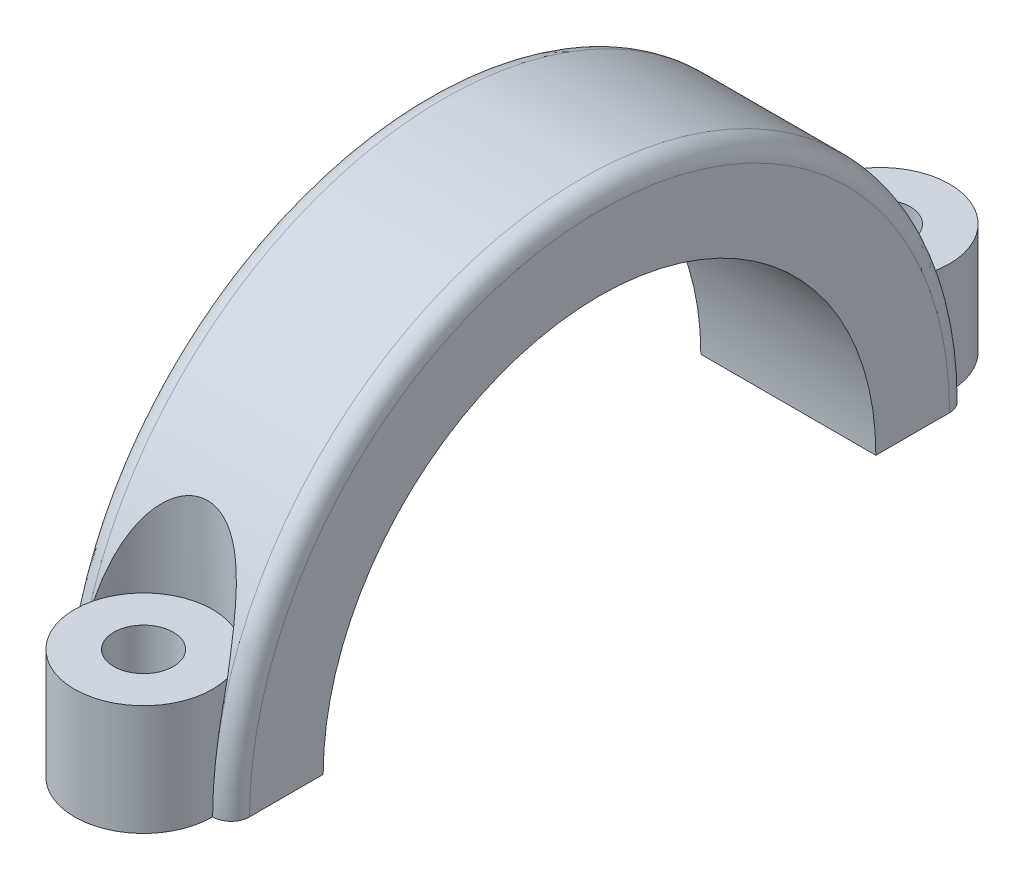
ISO-10303-21;
HEADER;
FILE_DESCRIPTION(('STEP AP214'),'2;1');
FILE_NAME('part.step','',(''),(''),'','','');
FILE_SCHEMA(('AUTOMOTIVE_DESIGN { 1 0 10303 214 1 1 1 1 }'));
ENDSEC;
DATA;
#1=APPLICATION_CONTEXT('core data for automotive mechanical design processes');
#2=APPLICATION_PROTOCOL_DEFINITION('international standard','automotive_design',2000,#1);
#3=PRODUCT_CONTEXT('',#1,'mechanical');
#4=PRODUCT('Part','Part','',(#3));
#5=PRODUCT_RELATED_PRODUCT_CATEGORY('part','',(#4));
#6=PRODUCT_DEFINITION_FORMATION('','',#4);
#7=PRODUCT_DEFINITION_CONTEXT('part definition',#1,'design');
#8=PRODUCT_DEFINITION('design','',#6,#7);
#9=PRODUCT_DEFINITION_SHAPE('','',#8);
#10=(LENGTH_UNIT() NAMED_UNIT(*) SI_UNIT(.MILLI.,.METRE.));
#11=(NAMED_UNIT(*) PLANE_ANGLE_UNIT() SI_UNIT($,.RADIAN.));
#12=(NAMED_UNIT(*) SI_UNIT($,.STERADIAN.) SOLID_ANGLE_UNIT());
#13=UNCERTAINTY_MEASURE_WITH_UNIT(LENGTH_MEASURE(1.E-05),#10,'distance_accuracy_value','');
#14=(GEOMETRIC_REPRESENTATION_CONTEXT(3) GLOBAL_UNCERTAINTY_ASSIGNED_CONTEXT((#13)) GLOBAL_UNIT_ASSIGNED_CONTEXT((#10,
#11,#12)) REPRESENTATION_CONTEXT('',''));
#15=CARTESIAN_POINT('',(0.,0.,0.));
#16=DIRECTION('',(0.,0.,1.));
#17=DIRECTION('',(1.,0.,0.));
#18=AXIS2_PLACEMENT_3D('',#15,#16,#17);
#19=CARTESIAN_POINT('',(12.065,0.,0.));
#20=DIRECTION('',(-1.,0.,0.));
#21=DIRECTION('',(0.,0.,1.));
#22=AXIS2_PLACEMENT_3D('',#19,#20,#21);
#23=CYLINDRICAL_SURFACE('',#22,50.8);
#24=CARTESIAN_POINT('',(9.525,0.,50.8));
#25=CARTESIAN_POINT('',(9.52499524301062,0.323784108117697,50.7999999648618));
#26=CARTESIAN_POINT('',(9.52500063813278,0.647560039520193,50.796904342456));
#27=CARTESIAN_POINT('',(9.52499030872866,1.29499363071079,50.7845235134187));
#28=CARTESIAN_POINT('',(9.52497458419629,1.61865129046479,50.7752383050037));
#29=CARTESIAN_POINT('',(9.524833601113,2.58925335265447,50.7381022328008));
#30=CARTESIAN_POINT('',(9.52461454281479,3.23586724527518,50.7009709216056));
#31=CARTESIAN_POINT('',(9.5230745866246,4.52327113701146,50.6023152371274));
#32=CARTESIAN_POINT('',(9.52176037301303,5.16407268459376,50.5409400288795));
#33=CARTESIAN_POINT('',(9.51662292577861,6.44289275223287,50.3938822741669));
#34=CARTESIAN_POINT('',(9.51279963935347,7.08091121343648,50.3081992161763));
#35=CARTESIAN_POINT('',(9.50067192560663,8.35324744973299,50.1126489497664));
#36=CARTESIAN_POINT('',(9.49236707769667,8.98756487183997,50.0027794720586));
#37=CARTESIAN_POINT('',(9.46874042044187,10.2514343945848,49.7590414176743));
#38=CARTESIAN_POINT('',(9.45341903193227,10.8809867787166,49.6251742806127));
#39=CARTESIAN_POINT('',(9.42274930643626,11.8228096901995,49.4061326748447));
#40=CARTESIAN_POINT('',(9.41119763481739,12.1372894464317,49.3298174313759));
#41=CARTESIAN_POINT('',(9.38505074642432,12.7646164837407,49.1712235836565));
#42=CARTESIAN_POINT('',(9.37045556794109,13.0774637853049,49.0889450544398));
#43=CARTESIAN_POINT('',(9.33771765798532,13.7014270502219,48.9184577558878));
#44=CARTESIAN_POINT('',(9.31957415274906,14.0125426206999,48.8302476958547));
#45=CARTESIAN_POINT('',(9.27917493970685,14.6328012028205,48.6479769352717));
#46=CARTESIAN_POINT('',(9.25691903983042,14.9419441216318,48.5539159615895));
#47=CARTESIAN_POINT('',(9.23232441302877,15.25,48.4569654435768));
#48=B_SPLINE_CURVE_WITH_KNOTS('',3,(#24,#25,#26,#27,#28,#29,#30,#31,#32,#33,#34,#35,#36,#37,#38,
#39,#40,#41,#42,#43,#44,#45,#46,#47),.UNSPECIFIED.,.F.,.F.,(4,2,2,2,2,2,2,2,2,2,2,4),(0.,
0.971321178069315,1.94264263603894,3.88516441042187,5.81591610707106,7.74670843679406,
9.67768200018313,11.6085397635848,12.5799192903469,13.5512865967242,14.5228659603849,
15.4944907133944),.UNSPECIFIED.);
#49=CARTESIAN_POINT('',(9.525,0.,50.8));
#50=VERTEX_POINT('',#49);
#51=CARTESIAN_POINT('',(9.23232441302877,15.25,48.4569654435768));
#52=VERTEX_POINT('',#51);
#53=EDGE_CURVE('E112',#50,#52,#48,.T.);
#54=ORIENTED_EDGE('',*,*,#53,.F.);
#55=CARTESIAN_POINT('',(9.525,0.,0.));
#56=DIRECTION('',(1.,0.,0.));
#57=DIRECTION('',(0.,0.,-1.));
#58=AXIS2_PLACEMENT_3D('',#55,#56,#57);
#59=CIRCLE('',#58,50.8);
#60=CARTESIAN_POINT('',(9.525,0.,-50.8));
#61=VERTEX_POINT('',#60);
#62=EDGE_CURVE('E264',#50,#61,#59,.F.);
#63=ORIENTED_EDGE('',*,*,#62,.T.);
#64=CARTESIAN_POINT('',(9.525,0.,-50.8));
#65=CARTESIAN_POINT('',(9.52499524301062,0.323784108117703,-50.7999999648618));
#66=CARTESIAN_POINT('',(9.52500063813278,0.647560039520198,-50.796904342456));
#67=CARTESIAN_POINT('',(9.52499030872866,1.2949936307108,-50.7845235134187));
#68=CARTESIAN_POINT('',(9.52497458419629,1.61865129046479,-50.7752383050037));
#69=CARTESIAN_POINT('',(9.524833601113,2.58925335265447,-50.7381022328008));
#70=CARTESIAN_POINT('',(9.52461454281479,3.23586724527518,-50.7009709216056));
#71=CARTESIAN_POINT('',(9.5230745866246,4.52327113701146,-50.6023152371274));
#72=CARTESIAN_POINT('',(9.52176037301303,5.16407268459376,-50.5409400288795));
#73=CARTESIAN_POINT('',(9.51662292577861,6.44289275223287,-50.3938822741669));
#74=CARTESIAN_POINT('',(9.51279963935347,7.08091121343648,-50.3081992161763));
#75=CARTESIAN_POINT('',(9.50067192560663,8.353247449733,-50.1126489497664));
#76=CARTESIAN_POINT('',(9.49236707769667,8.98756487183997,-50.0027794720586));
#77=CARTESIAN_POINT('',(9.46874042044187,10.2514343945848,-49.7590414176743));
#78=CARTESIAN_POINT('',(9.45341903193227,10.8809867787166,-49.6251742806127));
#79=CARTESIAN_POINT('',(9.42274930643626,11.8228096901995,-49.4061326748447));
#80=CARTESIAN_POINT('',(9.41119763481739,12.1372894464317,-49.3298174313759));
#81=CARTESIAN_POINT('',(9.38505074642432,12.7646164837407,-49.1712235836565));
#82=CARTESIAN_POINT('',(9.37045556794109,13.0774637853049,-49.0889450544398));
#83=CARTESIAN_POINT('',(9.33771765798532,13.7014270502219,-48.9184577558878));
#84=CARTESIAN_POINT('',(9.31957415274906,14.0125426206999,-48.8302476958547));
#85=CARTESIAN_POINT('',(9.27917493970685,14.6328012028205,-48.6479769352717));
#86=CARTESIAN_POINT('',(9.25691903983042,14.9419441216318,-48.5539159615895));
#87=CARTESIAN_POINT('',(9.23232441302877,15.25,-48.4569654435768));
#88=B_SPLINE_CURVE_WITH_KNOTS('',3,(#64,#65,#66,#67,#68,#69,#70,#71,#72,#73,#74,#75,#76,#77,#78,
#79,#80,#81,#82,#83,#84,#85,#86,#87),.UNSPECIFIED.,.F.,.F.,(4,2,2,2,2,2,2,2,2,2,2,4),(0.,
0.971321178069314,1.94264263603894,3.88516441042187,5.81591610707106,7.74670843679406,
9.67768200018313,11.6085397635848,12.5799192903469,13.5512865967242,14.5228659603849,
15.4944907133944),.UNSPECIFIED.);
#89=CARTESIAN_POINT('',(9.23232441302876,15.25,-48.4569654435768));
#90=VERTEX_POINT('',#89);
#91=EDGE_CURVE('E197',#61,#90,#88,.T.);
#92=ORIENTED_EDGE('',*,*,#91,.T.);
#93=CARTESIAN_POINT('',(9.23235120041083,15.2498,-48.4570283855707));
#94=CARTESIAN_POINT('',(9.18522638881166,15.6014587117969,-48.3463648711403));
#95=CARTESIAN_POINT('',(9.13499708919057,15.9515543219446,-48.2319739135129));
#96=CARTESIAN_POINT('',(9.02712526691807,16.6482379153794,-47.9959510668053));
#97=CARTESIAN_POINT('',(8.96948092552475,16.9948250155358,-47.8743174051981));
#98=CARTESIAN_POINT('',(8.84523887031784,17.6859276632865,-47.6233548096596));
#99=CARTESIAN_POINT('',(8.77859134956846,18.0304196714046,-47.4939854741127));
#100=CARTESIAN_POINT('',(8.63520341218567,18.7146742009327,-47.2285465671966));
#101=CARTESIAN_POINT('',(8.55846368404115,19.0544370432189,-47.092477453281));
#102=CARTESIAN_POINT('',(8.38909125786658,19.7457911737451,-46.806950853338));
#103=CARTESIAN_POINT('',(8.29584622541745,20.097098030416,-46.6571645650545));
#104=CARTESIAN_POINT('',(8.09438235177649,20.7927150766348,-46.3513467877677));
#105=CARTESIAN_POINT('',(7.98616176120967,21.1370244433717,-46.1953145706598));
#106=CARTESIAN_POINT('',(7.75267703115174,21.8164477216625,-45.8783474067616));
#107=CARTESIAN_POINT('',(7.62745480363361,22.1515818838614,-45.7174252489292));
#108=CARTESIAN_POINT('',(7.35714399629145,22.8116956161342,-45.3916504598138));
#109=CARTESIAN_POINT('',(7.21206184194566,23.1366784289761,-45.2267991139692));
#110=CARTESIAN_POINT('',(6.89843297122948,23.7754753467328,-44.8942851527211));
#111=CARTESIAN_POINT('',(6.72980482592874,24.089245732286,-44.7266146379124));
#112=CARTESIAN_POINT('',(6.36599404330493,24.7015019424877,-44.3914135119351));
#113=CARTESIAN_POINT('',(6.17079830709309,24.9999801269186,-44.2238830110528));
#114=CARTESIAN_POINT('',(5.75304583197571,25.5735508034141,-43.8946620827848));
#115=CARTESIAN_POINT('',(5.53088131108733,25.8488985658181,-43.7329238873445));
#116=CARTESIAN_POINT('',(5.05402709623586,26.3747863482101,-43.4177888719495));
#117=CARTESIAN_POINT('',(4.79938020992967,26.6253582617021,-43.2643814457825));
#118=CARTESIAN_POINT('',(4.26966362029435,27.0819091273838,-42.9799786753793));
#119=CARTESIAN_POINT('',(3.99648417914962,27.2895815506486,-42.848215102177));
#120=CARTESIAN_POINT('',(3.41715903115625,27.6690637105649,-42.6041535671033));
#121=CARTESIAN_POINT('',(3.11098051684749,27.840837248866,-42.4918752722128));
#122=CARTESIAN_POINT('',(2.62789069463921,28.0649695243252,-42.343897904961));
#123=CARTESIAN_POINT('',(2.4619220491559,28.1343763957633,-42.2977849305848));
#124=CARTESIAN_POINT('',(2.12320627790522,28.2603194515182,-42.2137425690608));
#125=CARTESIAN_POINT('',(1.95046282973072,28.316862508412,-42.1758088126811));
#126=CARTESIAN_POINT('',(1.59941491098995,28.415910107765,-42.1091394951715));
#127=CARTESIAN_POINT('',(1.42111528552077,28.4584265264412,-42.080396153247));
#128=CARTESIAN_POINT('',(1.06029072322424,28.5285209132247,-42.0329073220531));
#129=CARTESIAN_POINT('',(0.877766383009615,28.5561009773788,-42.0141604299687));
#130=CARTESIAN_POINT('',(0.529041646938692,28.5936298464793,-41.9886268707377));
#131=CARTESIAN_POINT('',(0.363077609540754,28.6050914830153,-41.980814363914));
#132=CARTESIAN_POINT('',(0.030582096196161,28.6151965274966,-41.973927253215));
#133=CARTESIAN_POINT('',(-0.135949338791823,28.6138408418763,-41.9748520314433));
#134=CARTESIAN_POINT('',(-0.468115301017656,28.5983407748568,-41.9854140153869));
#135=CARTESIAN_POINT('',(-0.633749917589236,28.5841976917204,-41.9950503366475));
#136=CARTESIAN_POINT('',(-0.962746838364978,28.5434188684291,-42.0227776891222));
#137=CARTESIAN_POINT('',(-1.1261091817242,28.5167833438152,-42.0408685744637));
#138=CARTESIAN_POINT('',(-1.43508262910439,28.454415610651,-42.0831024660083));
#139=CARTESIAN_POINT('',(-1.58099081563363,28.4196901113356,-42.1065728329459));
#140=CARTESIAN_POINT('',(-1.86909773715914,28.3408201089621,-42.1596984713993));
#141=CARTESIAN_POINT('',(-2.0112953126417,28.2966727003263,-42.1893556507732));
#142=CARTESIAN_POINT('',(-2.43127442428559,28.1509832546713,-42.2868276613504));
#143=CARTESIAN_POINT('',(-2.7026242402614,28.0361562499384,-42.3631688110983));
#144=CARTESIAN_POINT('',(-3.15231379739959,27.8124136494169,-42.5102609605935));
#145=CARTESIAN_POINT('',(-3.33570826545021,27.7105584618113,-42.5767745193356));
#146=CARTESIAN_POINT('',(-3.6911333543255,27.4930701519179,-42.7175358880945));
#147=CARTESIAN_POINT('',(-3.86315882949829,27.3774308563782,-42.7917871615828));
#148=CARTESIAN_POINT('',(-4.19590122823267,27.1340457390264,-42.9465293568611));
#149=CARTESIAN_POINT('',(-4.35659713210755,27.00627839536,-43.0270313229722));
#150=CARTESIAN_POINT('',(-4.66655422305021,26.7404753726302,-43.1927254581408));
#151=CARTESIAN_POINT('',(-4.81581732121104,26.602441417357,-43.2779168392121));
#152=CARTESIAN_POINT('',(-5.18204787147954,26.2395418368663,-43.4993440878932));
#153=CARTESIAN_POINT('',(-5.3914076481199,26.0084675986567,-43.6380195981482));
#154=CARTESIAN_POINT('',(-5.78608366158816,25.5292770508264,-43.9200804075425));
#155=CARTESIAN_POINT('',(-5.97138581659674,25.2811508888608,-44.0634684040955));
#156=CARTESIAN_POINT('',(-6.32051763537905,24.7707771948262,-44.3523927033534));
#157=CARTESIAN_POINT('',(-6.48431136993701,24.5085070409594,-44.4979321600195));
#158=CARTESIAN_POINT('',(-6.79246158100446,23.972647350455,-44.7888959218338));
#159=CARTESIAN_POINT('',(-6.93681056938826,23.69905350581,-44.9343201613025));
#160=CARTESIAN_POINT('',(-7.19842320572738,23.1626140327431,-45.21302931923));
#161=CARTESIAN_POINT('',(-7.31688854850832,22.9004121863888,-45.3464345913139));
#162=CARTESIAN_POINT('',(-7.5404936764931,22.3692630869549,-45.6107888747024));
#163=CARTESIAN_POINT('',(-7.64563552570952,22.1003168864305,-45.7417382637761));
#164=CARTESIAN_POINT('',(-7.84415840813845,21.5563669449214,-46.0005854318616));
#165=CARTESIAN_POINT('',(-7.93752861388656,21.2813578965645,-46.1284803149932));
#166=CARTESIAN_POINT('',(-8.11371325802051,20.7262970094558,-46.380529674833));
#167=CARTESIAN_POINT('',(-8.19652734060473,20.4462450010903,-46.5046840253563));
#168=CARTESIAN_POINT('',(-8.35283898417087,19.8815391640943,-46.7488940527323));
#169=CARTESIAN_POINT('',(-8.4263296918322,19.5968821217638,-46.8689466677051));
#170=CARTESIAN_POINT('',(-8.56498994027281,19.0236827574803,-47.1045175039349));
#171=CARTESIAN_POINT('',(-8.63015873904918,18.7351400916072,-47.2200353202224));
#172=CARTESIAN_POINT('',(-8.81458108402447,17.8646958204205,-47.5592266517257));
#173=CARTESIAN_POINT('',(-8.92285055450764,17.2776060252608,-47.7756991402217));
#174=CARTESIAN_POINT('',(-9.05864533925222,16.4472913363415,-48.0644376577784));
#175=CARTESIAN_POINT('',(-9.09571460708629,16.2085532499715,-48.1454725407958));
#176=CARTESIAN_POINT('',(-9.16645609725028,15.7300597993721,-48.3039183187987));
#177=CARTESIAN_POINT('',(-9.20013667736159,15.4903085373638,-48.3813378643115));
#178=CARTESIAN_POINT('',(-9.23235120041083,15.2498,-48.4570283855707));
#179=B_SPLINE_CURVE_WITH_KNOTS('',3,(#93,#94,#95,#96,#97,#98,#99,#100,#101,#102,#103,#104,#105,
#106,#107,#108,#109,#110,#111,#112,#113,#114,#115,#116,#117,#118,#119,#120,#121,#122,#123,#124,
#125,#126,#127,#128,#129,#130,#131,#132,#133,#134,#135,#136,#137,#138,#139,#140,#141,#142,#143,
#144,#145,#146,#147,#148,#149,#150,#151,#152,#153,#154,#155,#156,#157,#158,#159,#160,#161,#162,
#163,#164,#165,#166,#167,#168,#169,#170,#171,#172,#173,#174,#175,#176,#177,#178),.UNSPECIFIED.,
.F.,.F.,(4,2,2,2,2,2,2,2,2,2,2,2,2,2,2,2,2,2,2,2,2,2,2,2,2,2,2,2,2,2,2,2,2,2,2,2,2,2,2,2,2,2,4),
(0.,1.11498112347065,2.2302362499074,3.35193516202373,4.47355759166417,5.65257679892295,
6.83173385016446,8.00803513965995,9.18395674436279,10.364050676296,11.5447285639126,
12.7099289796496,13.8736093736072,14.9733666504816,16.0742275645706,16.6307420181423,
17.1869584483462,17.742702719643,18.298368982078,18.7972931092225,19.2961819529774,
19.7950201518596,20.2938497442522,20.7487846649762,21.2038600841664,22.1134540243881,
22.7728738273677,23.4325900708726,24.0934997171056,24.7542986443355,25.7764238545014,
26.7991446807126,27.8235527702976,28.8483542360575,29.7993934974996,30.7502852478573,
31.7020453371164,32.6538374976475,33.6063252862019,34.5588979418208,36.4627929258789,
37.2272435522731,37.9897599916397),.UNSPECIFIED.);
#180=CARTESIAN_POINT('',(-9.23232441302876,15.25,-48.4569654435768));
#181=VERTEX_POINT('',#180);
#182=EDGE_CURVE('E174',#90,#181,#179,.T.);
#183=ORIENTED_EDGE('',*,*,#182,.T.);
#184=CARTESIAN_POINT('',(-9.23232441302876,15.25,-48.4569654435768));
#185=CARTESIAN_POINT('',(-9.25691903983042,14.9419441216318,-48.5539159615895));
#186=CARTESIAN_POINT('',(-9.27917493970685,14.6328012028205,-48.6479769352717));
#187=CARTESIAN_POINT('',(-9.31957415274906,14.0125426206999,-48.8302476958547));
#188=CARTESIAN_POINT('',(-9.33771765798532,13.7014270502219,-48.9184577558878));
#189=CARTESIAN_POINT('',(-9.37045556794108,13.0774637853049,-49.0889450544398));
#190=CARTESIAN_POINT('',(-9.38505074642431,12.7646164837407,-49.1712235836565));
#191=CARTESIAN_POINT('',(-9.41119763481738,12.1372894464317,-49.3298174313758));
#192=CARTESIAN_POINT('',(-9.42274930643625,11.8228096901995,-49.4061326748446));
#193=CARTESIAN_POINT('',(-9.45341903193226,10.8809867787166,-49.6251742806127));
#194=CARTESIAN_POINT('',(-9.46874042044186,10.2514343945849,-49.7590414176743));
#195=CARTESIAN_POINT('',(-9.49236707769666,8.98756487183998,-50.0027794720585));
#196=CARTESIAN_POINT('',(-9.50067192560662,8.35324744973301,-50.1126489497664));
#197=CARTESIAN_POINT('',(-9.51279963935347,7.0809112134365,-50.3081992161763));
#198=CARTESIAN_POINT('',(-9.5166229257786,6.4428927522329,-50.3938822741669));
#199=CARTESIAN_POINT('',(-9.52176037301302,5.16407268459379,-50.5409400288795));
#200=CARTESIAN_POINT('',(-9.52307458662458,4.52327113701149,-50.6023152371274));
#201=CARTESIAN_POINT('',(-9.52461454281479,3.23586724527522,-50.7009709216056));
#202=CARTESIAN_POINT('',(-9.52483360111304,2.58925335265451,-50.7381022328008));
#203=CARTESIAN_POINT('',(-9.52497458419626,1.61865129046483,-50.7752383050037));
#204=CARTESIAN_POINT('',(-9.52499030872859,1.29499363071084,-50.7845235134187));
#205=CARTESIAN_POINT('',(-9.52500063813284,0.647560039520247,-50.796904342456));
#206=CARTESIAN_POINT('',(-9.52499524301084,0.323784108117753,-50.7999999648618));
#207=CARTESIAN_POINT('',(-9.5250000000006,0.,-50.8));
#208=B_SPLINE_CURVE_WITH_KNOTS('',3,(#184,#185,#186,#187,#188,#189,#190,#191,#192,#193,#194,
#195,#196,#197,#198,#199,#200,#201,#202,#203,#204,#205,#206,#207),.UNSPECIFIED.,.F.,.F.,(4,2,2,
2,2,2,2,2,2,2,2,4),(0.,0.971624753009543,1.94320411667025,2.9145714230475,3.88595094980956,
5.81680871321127,7.74778227660034,9.67857460632333,11.6093263029725,13.5518480773554,
14.5231695353251,15.4944907133944),.UNSPECIFIED.);
#209=CARTESIAN_POINT('',(-9.525,0.,-50.8));
#210=VERTEX_POINT('',#209);
#211=EDGE_CURVE('E188',#181,#210,#208,.T.);
#212=ORIENTED_EDGE('',*,*,#211,.T.);
#213=CARTESIAN_POINT('',(-9.525,0.,0.));
#214=DIRECTION('',(1.,0.,0.));
#215=DIRECTION('',(0.,0.,-1.));
#216=AXIS2_PLACEMENT_3D('',#213,#214,#215);
#217=CIRCLE('',#216,50.8);
#218=CARTESIAN_POINT('',(-9.52499999999999,0.,50.8));
#219=VERTEX_POINT('',#218);
#220=EDGE_CURVE('E262',#210,#219,#217,.T.);
#221=ORIENTED_EDGE('',*,*,#220,.T.);
#222=CARTESIAN_POINT('',(-9.23232441302876,15.25,48.4569654435768));
#223=CARTESIAN_POINT('',(-9.25691903983042,14.9419441216318,48.5539159615895));
#224=CARTESIAN_POINT('',(-9.27917493970685,14.6328012028205,48.6479769352717));
#225=CARTESIAN_POINT('',(-9.31957415274905,14.0125426206999,48.8302476958547));
#226=CARTESIAN_POINT('',(-9.33771765798531,13.7014270502219,48.9184577558878));
#227=CARTESIAN_POINT('',(-9.37045556794108,13.0774637853049,49.0889450544398));
#228=CARTESIAN_POINT('',(-9.38505074642431,12.7646164837407,49.1712235836565));
#229=CARTESIAN_POINT('',(-9.41119763481738,12.1372894464317,49.3298174313758));
#230=CARTESIAN_POINT('',(-9.42274930643625,11.8228096901995,49.4061326748447));
#231=CARTESIAN_POINT('',(-9.45341903193226,10.8809867787166,49.6251742806127));
#232=CARTESIAN_POINT('',(-9.46874042044186,10.2514343945849,49.7590414176743));
#233=CARTESIAN_POINT('',(-9.49236707769666,8.98756487183999,50.0027794720586));
#234=CARTESIAN_POINT('',(-9.50067192560662,8.35324744973301,50.1126489497664));
#235=CARTESIAN_POINT('',(-9.51279963935347,7.0809112134365,50.3081992161763));
#236=CARTESIAN_POINT('',(-9.5166229257786,6.4428927522329,50.3938822741669));
#237=CARTESIAN_POINT('',(-9.52176037301302,5.16407268459379,50.5409400288795));
#238=CARTESIAN_POINT('',(-9.52307458662458,4.52327113701149,50.6023152371274));
#239=CARTESIAN_POINT('',(-9.52461454281479,3.23586724527522,50.7009709216056));
#240=CARTESIAN_POINT('',(-9.52483360111304,2.58925335265451,50.7381022328008));
#241=CARTESIAN_POINT('',(-9.52497458419626,1.61865129046483,50.7752383050037));
#242=CARTESIAN_POINT('',(-9.52499030872859,1.29499363071084,50.7845235134187));
#243=CARTESIAN_POINT('',(-9.52500063813284,0.647560039520243,50.796904342456));
#244=CARTESIAN_POINT('',(-9.52499524301084,0.32378410811775,50.7999999648618));
#245=CARTESIAN_POINT('',(-9.5250000000006,0.,50.8));
#246=B_SPLINE_CURVE_WITH_KNOTS('',3,(#222,#223,#224,#225,#226,#227,#228,#229,#230,#231,#232,
#233,#234,#235,#236,#237,#238,#239,#240,#241,#242,#243,#244,#245),.UNSPECIFIED.,.F.,.F.,(4,2,2,
2,2,2,2,2,2,2,2,4),(0.,0.971624753009543,1.94320411667025,2.9145714230475,3.88595094980956,
5.81680871321127,7.74778227660034,9.67857460632333,11.6093263029725,13.5518480773554,
14.5231695353251,15.4944907133944),.UNSPECIFIED.);
#247=CARTESIAN_POINT('',(-9.23232441302876,15.25,48.4569654435768));
#248=VERTEX_POINT('',#247);
#249=EDGE_CURVE('E116',#248,#219,#246,.T.);
#250=ORIENTED_EDGE('',*,*,#249,.F.);
#251=CARTESIAN_POINT('',(9.23235120041083,15.2498,48.4570283855707));
#252=CARTESIAN_POINT('',(9.18522638881166,15.6014587117969,48.3463648711403));
#253=CARTESIAN_POINT('',(9.13499708919057,15.9515543219446,48.2319739135129));
#254=CARTESIAN_POINT('',(9.02712526691807,16.6482379153794,47.9959510668053));
#255=CARTESIAN_POINT('',(8.96948092552475,16.9948250155358,47.8743174051981));
#256=CARTESIAN_POINT('',(8.84523887031784,17.6859276632865,47.6233548096596));
#257=CARTESIAN_POINT('',(8.77859134956846,18.0304196714046,47.4939854741127));
#258=CARTESIAN_POINT('',(8.63520341218567,18.7146742009327,47.2285465671966));
#259=CARTESIAN_POINT('',(8.55846368404115,19.0544370432189,47.092477453281));
#260=CARTESIAN_POINT('',(8.38909125786658,19.7457911737451,46.806950853338));
#261=CARTESIAN_POINT('',(8.29584622541745,20.097098030416,46.6571645650545));
#262=CARTESIAN_POINT('',(8.09438235177649,20.7927150766348,46.3513467877677));
#263=CARTESIAN_POINT('',(7.98616176120967,21.1370244433717,46.1953145706598));
#264=CARTESIAN_POINT('',(7.75267703115174,21.8164477216625,45.8783474067616));
#265=CARTESIAN_POINT('',(7.62745480363361,22.1515818838614,45.7174252489292));
#266=CARTESIAN_POINT('',(7.35714399629145,22.8116956161342,45.3916504598138));
#267=CARTESIAN_POINT('',(7.21206184194566,23.1366784289761,45.2267991139692));
#268=CARTESIAN_POINT('',(6.89843297122948,23.7754753467328,44.8942851527211));
#269=CARTESIAN_POINT('',(6.72980482592874,24.089245732286,44.7266146379124));
#270=CARTESIAN_POINT('',(6.36599404330493,24.7015019424877,44.3914135119351));
#271=CARTESIAN_POINT('',(6.17079830709309,24.9999801269186,44.2238830110528));
#272=CARTESIAN_POINT('',(5.75304583197571,25.5735508034141,43.8946620827848));
#273=CARTESIAN_POINT('',(5.53088131108733,25.8488985658181,43.7329238873445));
#274=CARTESIAN_POINT('',(5.05402709623586,26.3747863482101,43.4177888719495));
#275=CARTESIAN_POINT('',(4.79938020992967,26.6253582617021,43.2643814457825));
#276=CARTESIAN_POINT('',(4.26966362029435,27.0819091273838,42.9799786753793));
#277=CARTESIAN_POINT('',(3.99648417914962,27.2895815506486,42.848215102177));
#278=CARTESIAN_POINT('',(3.41715903115625,27.6690637105649,42.6041535671033));
#279=CARTESIAN_POINT('',(3.11098051684749,27.840837248866,42.4918752722128));
#280=CARTESIAN_POINT('',(2.62789069463921,28.0649695243252,42.343897904961));
#281=CARTESIAN_POINT('',(2.4619220491559,28.1343763957633,42.2977849305848));
#282=CARTESIAN_POINT('',(2.12320627790522,28.2603194515182,42.2137425690608));
#283=CARTESIAN_POINT('',(1.95046282973072,28.316862508412,42.1758088126811));
#284=CARTESIAN_POINT('',(1.59941491098995,28.415910107765,42.1091394951715));
#285=CARTESIAN_POINT('',(1.42111528552077,28.4584265264412,42.080396153247));
#286=CARTESIAN_POINT('',(1.06029072322424,28.5285209132247,42.0329073220531));
#287=CARTESIAN_POINT('',(0.877766383009615,28.5561009773788,42.0141604299687));
#288=CARTESIAN_POINT('',(0.529041646938692,28.5936298464793,41.9886268707377));
#289=CARTESIAN_POINT('',(0.363077609540754,28.6050914830153,41.980814363914));
#290=CARTESIAN_POINT('',(0.030582096196161,28.6151965274966,41.973927253215));
#291=CARTESIAN_POINT('',(-0.135949338791823,28.6138408418763,41.9748520314433));
#292=CARTESIAN_POINT('',(-0.468115301017656,28.5983407748568,41.9854140153869));
#293=CARTESIAN_POINT('',(-0.633749917589236,28.5841976917204,41.9950503366475));
#294=CARTESIAN_POINT('',(-0.962746838364978,28.5434188684291,42.0227776891222));
#295=CARTESIAN_POINT('',(-1.1261091817242,28.5167833438152,42.0408685744637));
#296=CARTESIAN_POINT('',(-1.43508262910439,28.454415610651,42.0831024660083));
#297=CARTESIAN_POINT('',(-1.58099081563363,28.4196901113356,42.1065728329459));
#298=CARTESIAN_POINT('',(-1.86909773715914,28.3408201089621,42.1596984713993));
#299=CARTESIAN_POINT('',(-2.0112953126417,28.2966727003263,42.1893556507732));
#300=CARTESIAN_POINT('',(-2.43127442428559,28.1509832546713,42.2868276613504));
#301=CARTESIAN_POINT('',(-2.7026242402614,28.0361562499384,42.3631688110983));
#302=CARTESIAN_POINT('',(-3.15231379739959,27.8124136494169,42.5102609605935));
#303=CARTESIAN_POINT('',(-3.33570826545021,27.7105584618113,42.5767745193356));
#304=CARTESIAN_POINT('',(-3.6911333543255,27.4930701519179,42.7175358880945));
#305=CARTESIAN_POINT('',(-3.86315882949829,27.3774308563782,42.7917871615828));
#306=CARTESIAN_POINT('',(-4.19590122823267,27.1340457390264,42.9465293568611));
#307=CARTESIAN_POINT('',(-4.35659713210755,27.00627839536,43.0270313229722));
#308=CARTESIAN_POINT('',(-4.66655422305021,26.7404753726302,43.1927254581408));
#309=CARTESIAN_POINT('',(-4.81581732121104,26.602441417357,43.2779168392121));
#310=CARTESIAN_POINT('',(-5.18204787147954,26.2395418368663,43.4993440878932));
#311=CARTESIAN_POINT('',(-5.3914076481199,26.0084675986567,43.6380195981482));
#312=CARTESIAN_POINT('',(-5.78608366158816,25.5292770508264,43.9200804075425));
#313=CARTESIAN_POINT('',(-5.97138581659674,25.2811508888608,44.0634684040955));
#314=CARTESIAN_POINT('',(-6.32051763537905,24.7707771948262,44.3523927033534));
#315=CARTESIAN_POINT('',(-6.48431136993701,24.5085070409594,44.4979321600195));
#316=CARTESIAN_POINT('',(-6.79246158100446,23.972647350455,44.7888959218338));
#317=CARTESIAN_POINT('',(-6.93681056938826,23.69905350581,44.9343201613025));
#318=CARTESIAN_POINT('',(-7.19842320572738,23.1626140327431,45.21302931923));
#319=CARTESIAN_POINT('',(-7.31688854850832,22.9004121863888,45.3464345913139));
#320=CARTESIAN_POINT('',(-7.5404936764931,22.3692630869549,45.6107888747024));
#321=CARTESIAN_POINT('',(-7.64563552570952,22.1003168864305,45.7417382637761));
#322=CARTESIAN_POINT('',(-7.84415840813845,21.5563669449214,46.0005854318616));
#323=CARTESIAN_POINT('',(-7.93752861388656,21.2813578965645,46.1284803149932));
#324=CARTESIAN_POINT('',(-8.11371325802051,20.7262970094558,46.380529674833));
#325=CARTESIAN_POINT('',(-8.19652734060473,20.4462450010903,46.5046840253563));
#326=CARTESIAN_POINT('',(-8.35283898417087,19.8815391640943,46.7488940527323));
#327=CARTESIAN_POINT('',(-8.4263296918322,19.5968821217638,46.8689466677051));
#328=CARTESIAN_POINT('',(-8.56498994027281,19.0236827574803,47.1045175039349));
#329=CARTESIAN_POINT('',(-8.63015873904918,18.7351400916072,47.2200353202224));
#330=CARTESIAN_POINT('',(-8.81458108402447,17.8646958204205,47.5592266517257));
#331=CARTESIAN_POINT('',(-8.92285055450764,17.2776060252608,47.7756991402217));
#332=CARTESIAN_POINT('',(-9.05864533925222,16.4472913363415,48.0644376577784));
#333=CARTESIAN_POINT('',(-9.09571460708629,16.2085532499715,48.1454725407958));
#334=CARTESIAN_POINT('',(-9.16645609725028,15.7300597993721,48.3039183187987));
#335=CARTESIAN_POINT('',(-9.20013667736159,15.4903085373638,48.3813378643115));
#336=CARTESIAN_POINT('',(-9.23235120041083,15.2498,48.4570283855707));
#337=B_SPLINE_CURVE_WITH_KNOTS('',3,(#251,#252,#253,#254,#255,#256,#257,#258,#259,#260,#261,
#262,#263,#264,#265,#266,#267,#268,#269,#270,#271,#272,#273,#274,#275,#276,#277,#278,#279,#280,
#281,#282,#283,#284,#285,#286,#287,#288,#289,#290,#291,#292,#293,#294,#295,#296,#297,#298,#299,
#300,#301,#302,#303,#304,#305,#306,#307,#308,#309,#310,#311,#312,#313,#314,#315,#316,#317,#318,
#319,#320,#321,#322,#323,#324,#325,#326,#327,#328,#329,#330,#331,#332,#333,#334,#335,#336),
.UNSPECIFIED.,.F.,.F.,(4,2,2,2,2,2,2,2,2,2,2,2,2,2,2,2,2,2,2,2,2,2,2,2,2,2,2,2,2,2,2,2,2,2,2,2,
2,2,2,2,2,2,4),(0.,1.11498112347065,2.2302362499074,3.35193516202373,4.47355759166417,
5.65257679892295,6.83173385016446,8.00803513965995,9.18395674436279,10.364050676296,
11.5447285639126,12.7099289796496,13.8736093736072,14.9733666504816,16.0742275645706,
16.6307420181423,17.1869584483462,17.742702719643,18.298368982078,18.7972931092225,
19.2961819529774,19.7950201518596,20.2938497442522,20.7487846649762,21.2038600841664,
22.1134540243881,22.7728738273677,23.4325900708726,24.0934997171056,24.7542986443355,
25.7764238545014,26.7991446807126,27.8235527702976,28.8483542360575,29.7993934974996,
30.7502852478573,31.7020453371164,32.6538374976475,33.6063252862019,34.5588979418208,
36.4627929258789,37.2272435522731,37.9897599916397),.UNSPECIFIED.);
#338=EDGE_CURVE('E103',#52,#248,#337,.T.);
#339=ORIENTED_EDGE('',*,*,#338,.F.);
#340=EDGE_LOOP('',(#54,#63,#92,#183,#212,#221,#250,#339));
#341=FACE_BOUND('',#340,.T.);
#342=ADVANCED_FACE('F37',(#341),#23,.T.);
#343=CARTESIAN_POINT('',(12.065,0.,50.8));
#344=DIRECTION('',(0.,1.,0.));
#345=DIRECTION('',(0.,0.,1.));
#346=AXIS2_PLACEMENT_3D('',#343,#344,#345);
#347=PLANE('',#346);
#348=CARTESIAN_POINT('',(0.,0.,50.8));
#349=DIRECTION('',(0.,-1.,0.));
#350=DIRECTION('',(0.,0.,-1.));
#351=AXIS2_PLACEMENT_3D('',#348,#349,#350);
#352=CIRCLE('',#351,6.74751);
#353=CARTESIAN_POINT('',(0.,0.,44.05249));
#354=VERTEX_POINT('',#353);
#355=EDGE_CURVE('E117',#354,#354,#352,.T.);
#356=ORIENTED_EDGE('',*,*,#355,.F.);
#357=EDGE_LOOP('',(#356));
#358=FACE_BOUND('',#357,.T.);
#359=DIRECTION('',(0.,0.,-1.));
#360=VECTOR('',#359,1.);
#361=CARTESIAN_POINT('',(12.065,0.,50.8));
#362=LINE('',#361,#360);
#363=CARTESIAN_POINT('',(12.065,0.,48.26));
#364=VERTEX_POINT('',#363);
#365=CARTESIAN_POINT('',(12.065,0.,38.1));
#366=VERTEX_POINT('',#365);
#367=EDGE_CURVE('E232',#364,#366,#362,.T.);
#368=ORIENTED_EDGE('',*,*,#367,.F.);
#369=CARTESIAN_POINT('',(9.525,0.,48.26));
#370=DIRECTION('',(0.,1.,0.));
#371=DIRECTION('',(0.,0.,1.));
#372=AXIS2_PLACEMENT_3D('',#369,#370,#371);
#373=CIRCLE('',#372,2.54);
#374=EDGE_CURVE('E233',#364,#50,#373,.F.);
#375=ORIENTED_EDGE('',*,*,#374,.T.);
#376=CARTESIAN_POINT('',(0.,0.,50.8));
#377=DIRECTION('',(0.,1.,0.));
#378=DIRECTION('',(0.,0.,1.));
#379=AXIS2_PLACEMENT_3D('',#376,#377,#378);
#380=CIRCLE('',#379,9.525);
#381=EDGE_CURVE('E123',#219,#50,#380,.T.);
#382=ORIENTED_EDGE('',*,*,#381,.F.);
#383=CARTESIAN_POINT('',(-9.525,0.,48.26));
#384=DIRECTION('',(0.,1.,0.));
#385=DIRECTION('',(0.,0.,1.));
#386=AXIS2_PLACEMENT_3D('',#383,#384,#385);
#387=CIRCLE('',#386,2.54);
#388=CARTESIAN_POINT('',(-12.065,0.,48.26));
#389=VERTEX_POINT('',#388);
#390=EDGE_CURVE('E58',#219,#389,#387,.F.);
#391=ORIENTED_EDGE('',*,*,#390,.T.);
#392=DIRECTION('',(0.,0.,-1.));
#393=VECTOR('',#392,1.);
#394=CARTESIAN_POINT('',(-12.065,0.,50.8));
#395=LINE('',#394,#393);
#396=CARTESIAN_POINT('',(-12.065,0.,38.1));
#397=VERTEX_POINT('',#396);
#398=EDGE_CURVE('E248',#389,#397,#395,.T.);
#399=ORIENTED_EDGE('',*,*,#398,.T.);
#400=DIRECTION('',(-1.,0.,0.));
#401=VECTOR('',#400,1.);
#402=CARTESIAN_POINT('',(12.065,0.,38.1));
#403=LINE('',#402,#401);
#404=EDGE_CURVE('E235',#366,#397,#403,.T.);
#405=ORIENTED_EDGE('',*,*,#404,.F.);
#406=EDGE_LOOP('',(#368,#375,#382,#391,#399,#405));
#407=FACE_BOUND('',#406,.T.);
#408=ADVANCED_FACE('F221',(#358,#407),#347,.F.);
#409=CARTESIAN_POINT('',(12.065,0.,0.));
#410=DIRECTION('',(-1.,0.,0.));
#411=DIRECTION('',(0.,0.,1.));
#412=AXIS2_PLACEMENT_3D('',#409,#410,#411);
#413=CYLINDRICAL_SURFACE('',#412,38.1);
#414=CARTESIAN_POINT('',(-12.065,0.,0.));
#415=DIRECTION('',(-1.,0.,0.));
#416=DIRECTION('',(0.,0.,-1.));
#417=AXIS2_PLACEMENT_3D('',#414,#415,#416);
#418=CIRCLE('',#417,38.1);
#419=CARTESIAN_POINT('',(-12.065,0.,-38.1));
#420=VERTEX_POINT('',#419);
#421=EDGE_CURVE('E242',#397,#420,#418,.T.);
#422=ORIENTED_EDGE('',*,*,#421,.T.);
#423=DIRECTION('',(-1.,0.,0.));
#424=VECTOR('',#423,1.);
#425=CARTESIAN_POINT('',(12.065,0.,-38.1));
#426=LINE('',#425,#424);
#427=CARTESIAN_POINT('',(12.065,0.,-38.1));
#428=VERTEX_POINT('',#427);
#429=EDGE_CURVE('E247',#428,#420,#426,.T.);
#430=ORIENTED_EDGE('',*,*,#429,.F.);
#431=CARTESIAN_POINT('',(12.065,0.,0.));
#432=DIRECTION('',(-1.,0.,0.));
#433=DIRECTION('',(0.,0.,-1.));
#434=AXIS2_PLACEMENT_3D('',#431,#432,#433);
#435=CIRCLE('',#434,38.1);
#436=EDGE_CURVE('E238',#366,#428,#435,.T.);
#437=ORIENTED_EDGE('',*,*,#436,.F.);
#438=ORIENTED_EDGE('',*,*,#404,.T.);
#439=EDGE_LOOP('',(#422,#430,#437,#438));
#440=FACE_BOUND('',#439,.T.);
#441=ADVANCED_FACE('F218',(#440),#413,.F.);
#442=CARTESIAN_POINT('',(12.065,0.,-38.1));
#443=DIRECTION('',(0.,1.,0.));
#444=DIRECTION('',(0.,0.,1.));
#445=AXIS2_PLACEMENT_3D('',#442,#443,#444);
#446=PLANE('',#445);
#447=CARTESIAN_POINT('',(0.,0.,-50.8));
#448=DIRECTION('',(0.,-1.,0.));
#449=DIRECTION('',(0.,0.,-1.));
#450=AXIS2_PLACEMENT_3D('',#447,#448,#449);
#451=CIRCLE('',#450,6.74751);
#452=CARTESIAN_POINT('',(0.,0.,-57.54751));
#453=VERTEX_POINT('',#452);
#454=EDGE_CURVE('E124',#453,#453,#451,.T.);
#455=ORIENTED_EDGE('',*,*,#454,.F.);
#456=EDGE_LOOP('',(#455));
#457=FACE_BOUND('',#456,.T.);
#458=CARTESIAN_POINT('',(0.,0.,-50.8));
#459=DIRECTION('',(0.,-1.,0.));
#460=DIRECTION('',(0.,0.,-1.));
#461=AXIS2_PLACEMENT_3D('',#458,#459,#460);
#462=CIRCLE('',#461,9.525);
#463=EDGE_CURVE('E182',#210,#61,#462,.T.);
#464=ORIENTED_EDGE('',*,*,#463,.T.);
#465=CARTESIAN_POINT('',(9.525,0.,-48.26));
#466=DIRECTION('',(0.,1.,0.));
#467=DIRECTION('',(0.,0.,1.));
#468=AXIS2_PLACEMENT_3D('',#465,#466,#467);
#469=CIRCLE('',#468,2.54);
#470=CARTESIAN_POINT('',(12.065,0.,-48.26));
#471=VERTEX_POINT('',#470);
#472=EDGE_CURVE('E45',#61,#471,#469,.F.);
#473=ORIENTED_EDGE('',*,*,#472,.T.);
#474=DIRECTION('',(0.,0.,-1.));
#475=VECTOR('',#474,1.);
#476=CARTESIAN_POINT('',(12.065,0.,-38.1));
#477=LINE('',#476,#475);
#478=EDGE_CURVE('E240',#428,#471,#477,.T.);
#479=ORIENTED_EDGE('',*,*,#478,.F.);
#480=ORIENTED_EDGE('',*,*,#429,.T.);
#481=DIRECTION('',(0.,0.,-1.));
#482=VECTOR('',#481,1.);
#483=CARTESIAN_POINT('',(-12.065,0.,-38.1));
#484=LINE('',#483,#482);
#485=CARTESIAN_POINT('',(-12.065,0.,-48.26));
#486=VERTEX_POINT('',#485);
#487=EDGE_CURVE('E239',#420,#486,#484,.T.);
#488=ORIENTED_EDGE('',*,*,#487,.T.);
#489=CARTESIAN_POINT('',(-9.525,0.,-48.26));
#490=DIRECTION('',(0.,1.,0.));
#491=DIRECTION('',(0.,0.,1.));
#492=AXIS2_PLACEMENT_3D('',#489,#490,#491);
#493=CIRCLE('',#492,2.54);
#494=EDGE_CURVE('E266',#486,#210,#493,.F.);
#495=ORIENTED_EDGE('',*,*,#494,.T.);
#496=EDGE_LOOP('',(#464,#473,#479,#480,#488,#495));
#497=FACE_BOUND('',#496,.T.);
#498=ADVANCED_FACE('F212',(#457,#497),#446,.F.);
#499=CARTESIAN_POINT('',(12.065,0.,0.));
#500=DIRECTION('',(1.,0.,0.));
#501=DIRECTION('',(0.,0.,-1.));
#502=AXIS2_PLACEMENT_3D('',#499,#500,#501);
#503=PLANE('',#502);
#504=ORIENTED_EDGE('',*,*,#478,.T.);
#505=CARTESIAN_POINT('',(12.065,0.,0.));
#506=DIRECTION('',(1.,0.,0.));
#507=DIRECTION('',(0.,0.,-1.));
#508=AXIS2_PLACEMENT_3D('',#505,#506,#507);
#509=CIRCLE('',#508,48.26);
#510=EDGE_CURVE('E254',#471,#364,#509,.T.);
#511=ORIENTED_EDGE('',*,*,#510,.T.);
#512=ORIENTED_EDGE('',*,*,#367,.T.);
#513=ORIENTED_EDGE('',*,*,#436,.T.);
#514=EDGE_LOOP('',(#504,#511,#512,#513));
#515=FACE_BOUND('',#514,.T.);
#516=ADVANCED_FACE('F207',(#515),#503,.T.);
#517=CARTESIAN_POINT('',(-12.065,0.,0.));
#518=DIRECTION('',(1.,0.,0.));
#519=DIRECTION('',(0.,0.,-1.));
#520=AXIS2_PLACEMENT_3D('',#517,#518,#519);
#521=PLANE('',#520);
#522=ORIENTED_EDGE('',*,*,#398,.F.);
#523=CARTESIAN_POINT('',(-12.065,0.,0.));
#524=DIRECTION('',(1.,0.,0.));
#525=DIRECTION('',(0.,0.,-1.));
#526=AXIS2_PLACEMENT_3D('',#523,#524,#525);
#527=CIRCLE('',#526,48.26);
#528=EDGE_CURVE('E11',#389,#486,#527,.F.);
#529=ORIENTED_EDGE('',*,*,#528,.T.);
#530=ORIENTED_EDGE('',*,*,#487,.F.);
#531=ORIENTED_EDGE('',*,*,#421,.F.);
#532=EDGE_LOOP('',(#522,#529,#530,#531));
#533=FACE_BOUND('',#532,.T.);
#534=ADVANCED_FACE('F211',(#533),#521,.F.);
#535=CARTESIAN_POINT('',(0.,15.25,-50.8));
#536=DIRECTION('',(0.,-1.,0.));
#537=DIRECTION('',(0.,0.,-1.));
#538=AXIS2_PLACEMENT_3D('',#535,#536,#537);
#539=PLANE('',#538);
#540=CARTESIAN_POINT('',(0.,15.25,-50.8));
#541=DIRECTION('',(0.,-1.,0.));
#542=DIRECTION('',(0.,0.,-1.));
#543=AXIS2_PLACEMENT_3D('',#540,#541,#542);
#544=CIRCLE('',#543,4.10209999999999);
#545=CARTESIAN_POINT('',(0.,15.25,-54.9021));
#546=VERTEX_POINT('',#545);
#547=EDGE_CURVE('E255',#546,#546,#544,.T.);
#548=ORIENTED_EDGE('',*,*,#547,.T.);
#549=EDGE_LOOP('',(#548));
#550=FACE_BOUND('',#549,.T.);
#551=CARTESIAN_POINT('',(0.,15.25,-50.8));
#552=DIRECTION('',(0.,-1.,0.));
#553=DIRECTION('',(0.,0.,-1.));
#554=AXIS2_PLACEMENT_3D('',#551,#552,#553);
#555=CIRCLE('',#554,9.525);
#556=EDGE_CURVE('E185',#181,#90,#555,.T.);
#557=ORIENTED_EDGE('',*,*,#556,.F.);
#558=CARTESIAN_POINT('',(0.,15.25,-50.8));
#559=DIRECTION('',(0.,-1.,0.));
#560=DIRECTION('',(0.,0.,-1.));
#561=AXIS2_PLACEMENT_3D('',#558,#559,#560);
#562=CIRCLE('',#561,9.525);
#563=EDGE_CURVE('E183',#90,#181,#562,.T.);
#564=ORIENTED_EDGE('',*,*,#563,.F.);
#565=EDGE_LOOP('',(#557,#564));
#566=FACE_BOUND('',#565,.T.);
#567=ADVANCED_FACE('F171',(#550,#566),#539,.F.);
#568=CARTESIAN_POINT('',(0.,15.25,-50.8));
#569=DIRECTION('',(0.,-1.,0.));
#570=DIRECTION('',(0.,0.,-1.));
#571=AXIS2_PLACEMENT_3D('',#568,#569,#570);
#572=CYLINDRICAL_SURFACE('',#571,9.525);
#573=ORIENTED_EDGE('',*,*,#91,.F.);
#574=ORIENTED_EDGE('',*,*,#463,.F.);
#575=ORIENTED_EDGE('',*,*,#211,.F.);
#576=ORIENTED_EDGE('',*,*,#556,.T.);
#577=EDGE_LOOP('',(#573,#574,#575,#576));
#578=FACE_BOUND('',#577,.T.);
#579=ADVANCED_FACE('F169',(#578),#572,.T.);
#580=CARTESIAN_POINT('',(0.,15.25,-50.8));
#581=DIRECTION('',(0.,-1.,0.));
#582=DIRECTION('',(0.,0.,-1.));
#583=AXIS2_PLACEMENT_3D('',#580,#581,#582);
#584=CONICAL_SURFACE('',#583,9.525,0.05235987755983);
#585=ORIENTED_EDGE('',*,*,#563,.T.);
#586=ORIENTED_EDGE('',*,*,#182,.F.);
#587=EDGE_LOOP('',(#585,#586));
#588=FACE_BOUND('',#587,.T.);
#589=ADVANCED_FACE('F164',(#588),#584,.F.);
#590=CARTESIAN_POINT('',(0.,0.,-50.8));
#591=DIRECTION('',(0.,-1.,0.));
#592=DIRECTION('',(0.,0.,-1.));
#593=AXIS2_PLACEMENT_3D('',#590,#591,#592);
#594=CYLINDRICAL_SURFACE('',#593,4.10209999999999);
#595=CARTESIAN_POINT('',(0.,7.9375,-50.8));
#596=DIRECTION('',(0.,-1.,0.));
#597=DIRECTION('',(0.,0.,-1.));
#598=AXIS2_PLACEMENT_3D('',#595,#596,#597);
#599=CIRCLE('',#598,4.1021);
#600=CARTESIAN_POINT('',(0.,7.9375,-54.9021));
#601=VERTEX_POINT('',#600);
#602=EDGE_CURVE('E258',#601,#601,#599,.T.);
#603=ORIENTED_EDGE('',*,*,#602,.T.);
#604=EDGE_LOOP('',(#603));
#605=FACE_BOUND('',#604,.T.);
#606=ORIENTED_EDGE('',*,*,#547,.F.);
#607=EDGE_LOOP('',(#606));
#608=FACE_BOUND('',#607,.T.);
#609=ADVANCED_FACE('F160',(#605,#608),#594,.F.);
#610=CARTESIAN_POINT('',(4.1021,7.9375,-50.8));
#611=DIRECTION('',(0.,1.,0.));
#612=DIRECTION('',(0.,0.,1.));
#613=AXIS2_PLACEMENT_3D('',#610,#611,#612);
#614=PLANE('',#613);
#615=ORIENTED_EDGE('',*,*,#602,.F.);
#616=EDGE_LOOP('',(#615));
#617=FACE_BOUND('',#616,.T.);
#618=CARTESIAN_POINT('',(0.,7.9375,-50.8));
#619=DIRECTION('',(0.,-1.,0.));
#620=DIRECTION('',(0.,0.,-1.));
#621=AXIS2_PLACEMENT_3D('',#618,#619,#620);
#622=CIRCLE('',#621,6.74751);
#623=CARTESIAN_POINT('',(0.,7.9375,-57.54751));
#624=VERTEX_POINT('',#623);
#625=EDGE_CURVE('E454',#624,#624,#622,.T.);
#626=ORIENTED_EDGE('',*,*,#625,.T.);
#627=EDGE_LOOP('',(#626));
#628=FACE_BOUND('',#627,.T.);
#629=ADVANCED_FACE('F156',(#617,#628),#614,.F.);
#630=CARTESIAN_POINT('',(0.,0.,-50.8));
#631=DIRECTION('',(0.,-1.,0.));
#632=DIRECTION('',(0.,0.,-1.));
#633=AXIS2_PLACEMENT_3D('',#630,#631,#632);
#634=CYLINDRICAL_SURFACE('',#633,6.74751);
#635=ORIENTED_EDGE('',*,*,#625,.F.);
#636=EDGE_LOOP('',(#635));
#637=FACE_BOUND('',#636,.T.);
#638=ORIENTED_EDGE('',*,*,#454,.T.);
#639=EDGE_LOOP('',(#638));
#640=FACE_BOUND('',#639,.T.);
#641=ADVANCED_FACE('F152',(#637,#640),#634,.F.);
#642=CARTESIAN_POINT('',(0.,15.25,50.8));
#643=DIRECTION('',(0.,-1.,0.));
#644=DIRECTION('',(0.,0.,1.));
#645=AXIS2_PLACEMENT_3D('',#642,#643,#644);
#646=PLANE('',#645);
#647=CARTESIAN_POINT('',(0.,15.25,50.8));
#648=DIRECTION('',(0.,-1.,0.));
#649=DIRECTION('',(0.,0.,-1.));
#650=AXIS2_PLACEMENT_3D('',#647,#648,#649);
#651=CIRCLE('',#650,4.10209999999999);
#652=CARTESIAN_POINT('',(0.,15.25,46.6979));
#653=VERTEX_POINT('',#652);
#654=EDGE_CURVE('E129',#653,#653,#651,.T.);
#655=ORIENTED_EDGE('',*,*,#654,.T.);
#656=EDGE_LOOP('',(#655));
#657=FACE_BOUND('',#656,.T.);
#658=CARTESIAN_POINT('',(0.,15.25,50.8));
#659=DIRECTION('',(0.,1.,0.));
#660=DIRECTION('',(0.,0.,1.));
#661=AXIS2_PLACEMENT_3D('',#658,#659,#660);
#662=CIRCLE('',#661,9.525);
#663=EDGE_CURVE('E122',#248,#52,#662,.T.);
#664=ORIENTED_EDGE('',*,*,#663,.T.);
#665=CARTESIAN_POINT('',(0.,15.25,50.8));
#666=DIRECTION('',(0.,1.,0.));
#667=DIRECTION('',(0.,0.,1.));
#668=AXIS2_PLACEMENT_3D('',#665,#666,#667);
#669=CIRCLE('',#668,9.525);
#670=EDGE_CURVE('E100',#52,#248,#669,.T.);
#671=ORIENTED_EDGE('',*,*,#670,.T.);
#672=EDGE_LOOP('',(#664,#671));
#673=FACE_BOUND('',#672,.T.);
#674=ADVANCED_FACE('F126',(#657,#673),#646,.F.);
#675=CARTESIAN_POINT('',(0.,15.25,50.8));
#676=DIRECTION('',(0.,-1.,0.));
#677=DIRECTION('',(0.,0.,-1.));
#678=AXIS2_PLACEMENT_3D('',#675,#676,#677);
#679=CYLINDRICAL_SURFACE('',#678,9.525);
#680=ORIENTED_EDGE('',*,*,#381,.T.);
#681=ORIENTED_EDGE('',*,*,#53,.T.);
#682=ORIENTED_EDGE('',*,*,#663,.F.);
#683=ORIENTED_EDGE('',*,*,#249,.T.);
#684=EDGE_LOOP('',(#680,#681,#682,#683));
#685=FACE_BOUND('',#684,.T.);
#686=ADVANCED_FACE('F121',(#685),#679,.T.);
#687=CARTESIAN_POINT('',(0.,0.,50.8));
#688=DIRECTION('',(0.,-1.,0.));
#689=DIRECTION('',(0.,0.,-1.));
#690=AXIS2_PLACEMENT_3D('',#687,#688,#689);
#691=CYLINDRICAL_SURFACE('',#690,4.10209999999999);
#692=CARTESIAN_POINT('',(0.,7.9375,50.8));
#693=DIRECTION('',(0.,-1.,0.));
#694=DIRECTION('',(0.,0.,-1.));
#695=AXIS2_PLACEMENT_3D('',#692,#693,#694);
#696=CIRCLE('',#695,4.1021);
#697=CARTESIAN_POINT('',(0.,7.9375,46.6979));
#698=VERTEX_POINT('',#697);
#699=EDGE_CURVE('E310',#698,#698,#696,.T.);
#700=ORIENTED_EDGE('',*,*,#699,.T.);
#701=EDGE_LOOP('',(#700));
#702=FACE_BOUND('',#701,.T.);
#703=ORIENTED_EDGE('',*,*,#654,.F.);
#704=EDGE_LOOP('',(#703));
#705=FACE_BOUND('',#704,.T.);
#706=ADVANCED_FACE('F150',(#702,#705),#691,.F.);
#707=CARTESIAN_POINT('',(4.1021,7.9375,50.8));
#708=DIRECTION('',(0.,1.,0.));
#709=DIRECTION('',(0.,0.,1.));
#710=AXIS2_PLACEMENT_3D('',#707,#708,#709);
#711=PLANE('',#710);
#712=ORIENTED_EDGE('',*,*,#699,.F.);
#713=EDGE_LOOP('',(#712));
#714=FACE_BOUND('',#713,.T.);
#715=CARTESIAN_POINT('',(0.,7.9375,50.8));
#716=DIRECTION('',(0.,-1.,0.));
#717=DIRECTION('',(0.,0.,-1.));
#718=AXIS2_PLACEMENT_3D('',#715,#716,#717);
#719=CIRCLE('',#718,6.74751);
#720=CARTESIAN_POINT('',(0.,7.9375,44.05249));
#721=VERTEX_POINT('',#720);
#722=EDGE_CURVE('E308',#721,#721,#719,.T.);
#723=ORIENTED_EDGE('',*,*,#722,.T.);
#724=EDGE_LOOP('',(#723));
#725=FACE_BOUND('',#724,.T.);
#726=ADVANCED_FACE('F297',(#714,#725),#711,.F.);
#727=CARTESIAN_POINT('',(0.,0.,50.8));
#728=DIRECTION('',(0.,-1.,0.));
#729=DIRECTION('',(0.,0.,-1.));
#730=AXIS2_PLACEMENT_3D('',#727,#728,#729);
#731=CYLINDRICAL_SURFACE('',#730,6.74751);
#732=ORIENTED_EDGE('',*,*,#722,.F.);
#733=EDGE_LOOP('',(#732));
#734=FACE_BOUND('',#733,.T.);
#735=ORIENTED_EDGE('',*,*,#355,.T.);
#736=EDGE_LOOP('',(#735));
#737=FACE_BOUND('',#736,.T.);
#738=ADVANCED_FACE('F292',(#734,#737),#731,.F.);
#739=CARTESIAN_POINT('',(0.,15.25,50.8));
#740=DIRECTION('',(0.,-1.,0.));
#741=DIRECTION('',(0.,0.,1.));
#742=AXIS2_PLACEMENT_3D('',#739,#740,#741);
#743=CONICAL_SURFACE('',#742,9.525,0.05235987755983);
#744=ORIENTED_EDGE('',*,*,#338,.T.);
#745=ORIENTED_EDGE('',*,*,#670,.F.);
#746=EDGE_LOOP('',(#744,#745));
#747=FACE_BOUND('',#746,.T.);
#748=ADVANCED_FACE('F102',(#747),#743,.F.);
#749=CARTESIAN_POINT('',(9.525,0.,0.));
#750=DIRECTION('',(1.,0.,0.));
#751=DIRECTION('',(0.,0.,-1.));
#752=AXIS2_PLACEMENT_3D('',#749,#750,#751);
#753=TOROIDAL_SURFACE('',#752,48.26,2.54);
#754=ORIENTED_EDGE('',*,*,#472,.F.);
#755=ORIENTED_EDGE('',*,*,#62,.F.);
#756=ORIENTED_EDGE('',*,*,#374,.F.);
#757=ORIENTED_EDGE('',*,*,#510,.F.);
#758=EDGE_LOOP('',(#754,#755,#756,#757));
#759=FACE_BOUND('',#758,.T.);
#760=ADVANCED_FACE('F274',(#759),#753,.T.);
#761=CARTESIAN_POINT('',(-9.525,0.,0.));
#762=DIRECTION('',(1.,0.,0.));
#763=DIRECTION('',(0.,0.,-1.));
#764=AXIS2_PLACEMENT_3D('',#761,#762,#763);
#765=TOROIDAL_SURFACE('',#764,48.26,2.54);
#766=ORIENTED_EDGE('',*,*,#494,.F.);
#767=ORIENTED_EDGE('',*,*,#528,.F.);
#768=ORIENTED_EDGE('',*,*,#390,.F.);
#769=ORIENTED_EDGE('',*,*,#220,.F.);
#770=EDGE_LOOP('',(#766,#767,#768,#769));
#771=FACE_BOUND('',#770,.T.);
#772=ADVANCED_FACE('F39',(#771),#765,.T.);
#773=CLOSED_SHELL('',(#342,#408,#441,#498,#516,#534,#567,#579,#589,#609,#629,#641,#674,#686,
#706,#726,#738,#748,#760,#772));
#774=MANIFOLD_SOLID_BREP('B2',#773);
#775=ADVANCED_BREP_SHAPE_REPRESENTATION('',(#18,#774),#14);
#776=SHAPE_DEFINITION_REPRESENTATION(#9,#775);
ENDSEC;
END-ISO-10303-21;
